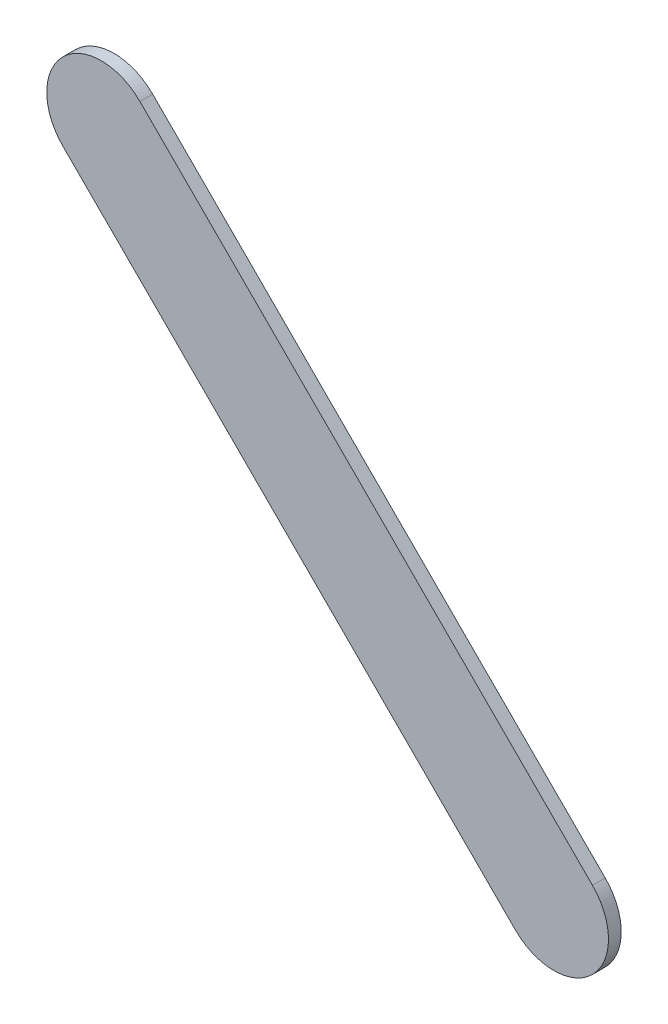
ISO-10303-21;
HEADER;
FILE_DESCRIPTION(('STEP AP214'),'2;1');
FILE_NAME('part.step','',(''),(''),'','','');
FILE_SCHEMA(('AUTOMOTIVE_DESIGN { 1 0 10303 214 1 1 1 1 }'));
ENDSEC;
DATA;
#1=APPLICATION_CONTEXT('core data for automotive mechanical design processes');
#2=APPLICATION_PROTOCOL_DEFINITION('international standard','automotive_design',2000,#1);
#3=PRODUCT_CONTEXT('',#1,'mechanical');
#4=PRODUCT('Part','Part','',(#3));
#5=PRODUCT_RELATED_PRODUCT_CATEGORY('part','',(#4));
#6=PRODUCT_DEFINITION_FORMATION('','',#4);
#7=PRODUCT_DEFINITION_CONTEXT('part definition',#1,'design');
#8=PRODUCT_DEFINITION('design','',#6,#7);
#9=PRODUCT_DEFINITION_SHAPE('','',#8);
#10=(LENGTH_UNIT() NAMED_UNIT(*) SI_UNIT(.MILLI.,.METRE.));
#11=(NAMED_UNIT(*) PLANE_ANGLE_UNIT() SI_UNIT($,.RADIAN.));
#12=(NAMED_UNIT(*) SI_UNIT($,.STERADIAN.) SOLID_ANGLE_UNIT());
#13=UNCERTAINTY_MEASURE_WITH_UNIT(LENGTH_MEASURE(1.E-05),#10,'distance_accuracy_value','');
#14=(GEOMETRIC_REPRESENTATION_CONTEXT(3) GLOBAL_UNCERTAINTY_ASSIGNED_CONTEXT((#13)) GLOBAL_UNIT_ASSIGNED_CONTEXT((#10,
#11,#12)) REPRESENTATION_CONTEXT('',''));
#15=CARTESIAN_POINT('',(0.,0.,0.));
#16=DIRECTION('',(0.,0.,1.));
#17=DIRECTION('',(1.,0.,0.));
#18=AXIS2_PLACEMENT_3D('',#15,#16,#17);
#19=CARTESIAN_POINT('',(95.259619,-129.493933,1.635));
#20=DIRECTION('',(0.,0.,1.));
#21=DIRECTION('',(1.,0.,0.));
#22=AXIS2_PLACEMENT_3D('',#19,#20,#21);
#23=PLANE('',#22);
#24=DIRECTION('',(-0.707106781186548,0.707106781186548,0.));
#25=VECTOR('',#24,1.);
#26=CARTESIAN_POINT('',(95.259619,-129.493933,1.635));
#27=LINE('',#26,#25);
#28=CARTESIAN_POINT('',(95.259619,-129.493933,1.635));
#29=VERTEX_POINT('',#28);
#30=CARTESIAN_POINT('',(94.015254,-128.249568,1.635));
#31=VERTEX_POINT('',#30);
#32=EDGE_CURVE('E82',#29,#31,#27,.T.);
#33=ORIENTED_EDGE('',*,*,#32,.T.);
#34=CARTESIAN_POINT('',(93.9091875,-128.3556345,1.635));
#35=DIRECTION('',(0.,0.,1.));
#36=DIRECTION('',(0.707106781186548,0.707106781186548,0.));
#37=AXIS2_PLACEMENT_3D('',#34,#35,#36);
#38=CIRCLE('',#37,0.150000682813);
#39=CARTESIAN_POINT('',(93.803121,-128.461701,1.635));
#40=VERTEX_POINT('',#39);
#41=EDGE_CURVE('E110',#31,#40,#38,.T.);
#42=ORIENTED_EDGE('',*,*,#41,.T.);
#43=DIRECTION('',(0.707106781186548,-0.707106781186548,0.));
#44=VECTOR('',#43,1.);
#45=CARTESIAN_POINT('',(93.803121,-128.461701,1.635));
#46=LINE('',#45,#44);
#47=CARTESIAN_POINT('',(95.047486,-129.706066,1.635));
#48=VERTEX_POINT('',#47);
#49=EDGE_CURVE('E75',#40,#48,#46,.T.);
#50=ORIENTED_EDGE('',*,*,#49,.T.);
#51=CARTESIAN_POINT('',(95.1535525,-129.5999995,1.635));
#52=DIRECTION('',(0.,0.,1.));
#53=DIRECTION('',(-0.707106781186548,-0.707106781186548,0.));
#54=AXIS2_PLACEMENT_3D('',#51,#52,#53);
#55=CIRCLE('',#54,0.150000682813);
#56=EDGE_CURVE('E11',#48,#29,#55,.T.);
#57=ORIENTED_EDGE('',*,*,#56,.T.);
#58=EDGE_LOOP('',(#33,#42,#50,#57));
#59=FACE_BOUND('',#58,.T.);
#60=ADVANCED_FACE('F17',(#59),#23,.T.);
#61=CARTESIAN_POINT('',(95.259619,-129.493933,1.6));
#62=DIRECTION('',(0.,0.,1.));
#63=DIRECTION('',(1.,0.,0.));
#64=AXIS2_PLACEMENT_3D('',#61,#62,#63);
#65=PLANE('',#64);
#66=CARTESIAN_POINT('',(95.1535525,-129.5999995,1.6));
#67=DIRECTION('',(0.,0.,1.));
#68=DIRECTION('',(-0.707106781186548,-0.707106781186548,0.));
#69=AXIS2_PLACEMENT_3D('',#66,#67,#68);
#70=CIRCLE('',#69,0.150000682813);
#71=CARTESIAN_POINT('',(95.047486,-129.706066,1.6));
#72=VERTEX_POINT('',#71);
#73=CARTESIAN_POINT('',(95.259619,-129.493933,1.6));
#74=VERTEX_POINT('',#73);
#75=EDGE_CURVE('E20',#72,#74,#70,.T.);
#76=ORIENTED_EDGE('',*,*,#75,.F.);
#77=DIRECTION('',(0.707106781186548,-0.707106781186548,0.));
#78=VECTOR('',#77,1.);
#79=CARTESIAN_POINT('',(93.803121,-128.461701,1.6));
#80=LINE('',#79,#78);
#81=CARTESIAN_POINT('',(93.803121,-128.461701,1.6));
#82=VERTEX_POINT('',#81);
#83=EDGE_CURVE('E101',#82,#72,#80,.T.);
#84=ORIENTED_EDGE('',*,*,#83,.F.);
#85=CARTESIAN_POINT('',(93.9091875,-128.3556345,1.6));
#86=DIRECTION('',(0.,0.,1.));
#87=DIRECTION('',(0.707106781186548,0.707106781186548,0.));
#88=AXIS2_PLACEMENT_3D('',#85,#86,#87);
#89=CIRCLE('',#88,0.150000682813);
#90=CARTESIAN_POINT('',(94.015254,-128.249568,1.6));
#91=VERTEX_POINT('',#90);
#92=EDGE_CURVE('E84',#91,#82,#89,.T.);
#93=ORIENTED_EDGE('',*,*,#92,.F.);
#94=DIRECTION('',(-0.707106781186548,0.707106781186548,0.));
#95=VECTOR('',#94,1.);
#96=CARTESIAN_POINT('',(95.259619,-129.493933,1.6));
#97=LINE('',#96,#95);
#98=EDGE_CURVE('E80',#74,#91,#97,.T.);
#99=ORIENTED_EDGE('',*,*,#98,.F.);
#100=EDGE_LOOP('',(#76,#84,#93,#99));
#101=FACE_BOUND('',#100,.T.);
#102=ADVANCED_FACE('F86',(#101),#65,.F.);
#103=CARTESIAN_POINT('',(95.1535525,-129.5999995,1.6));
#104=DIRECTION('',(0.,0.,-1.));
#105=DIRECTION('',(-0.707106781186548,-0.707106781186548,0.));
#106=AXIS2_PLACEMENT_3D('',#103,#104,#105);
#107=CYLINDRICAL_SURFACE('',#106,0.150000682813);
#108=ORIENTED_EDGE('',*,*,#75,.T.);
#109=DIRECTION('',(0.,0.,1.));
#110=VECTOR('',#109,1.);
#111=CARTESIAN_POINT('',(95.259619,-129.493933,1.6));
#112=LINE('',#111,#110);
#113=EDGE_CURVE('E69',#74,#29,#112,.T.);
#114=ORIENTED_EDGE('',*,*,#113,.T.);
#115=ORIENTED_EDGE('',*,*,#56,.F.);
#116=DIRECTION('',(0.,0.,1.));
#117=VECTOR('',#116,1.);
#118=CARTESIAN_POINT('',(95.047486,-129.706066,1.6));
#119=LINE('',#118,#117);
#120=EDGE_CURVE('E72',#72,#48,#119,.T.);
#121=ORIENTED_EDGE('',*,*,#120,.F.);
#122=EDGE_LOOP('',(#108,#114,#115,#121));
#123=FACE_BOUND('',#122,.T.);
#124=ADVANCED_FACE('F68',(#123),#107,.T.);
#125=CARTESIAN_POINT('',(93.803121,-128.461701,1.6));
#126=DIRECTION('',(0.707106781186548,0.707106781186548,0.));
#127=DIRECTION('',(0.,0.,-1.));
#128=AXIS2_PLACEMENT_3D('',#125,#126,#127);
#129=PLANE('',#128);
#130=ORIENTED_EDGE('',*,*,#83,.T.);
#131=ORIENTED_EDGE('',*,*,#120,.T.);
#132=ORIENTED_EDGE('',*,*,#49,.F.);
#133=DIRECTION('',(0.,0.,1.));
#134=VECTOR('',#133,1.);
#135=CARTESIAN_POINT('',(93.803121,-128.461701,1.6));
#136=LINE('',#135,#134);
#137=EDGE_CURVE('E106',#82,#40,#136,.T.);
#138=ORIENTED_EDGE('',*,*,#137,.F.);
#139=EDGE_LOOP('',(#130,#131,#132,#138));
#140=FACE_BOUND('',#139,.T.);
#141=ADVANCED_FACE('F118',(#140),#129,.F.);
#142=CARTESIAN_POINT('',(93.9091875,-128.3556345,1.6));
#143=DIRECTION('',(0.,0.,-1.));
#144=DIRECTION('',(0.707106781186548,0.707106781186548,0.));
#145=AXIS2_PLACEMENT_3D('',#142,#143,#144);
#146=CYLINDRICAL_SURFACE('',#145,0.150000682813);
#147=ORIENTED_EDGE('',*,*,#92,.T.);
#148=ORIENTED_EDGE('',*,*,#137,.T.);
#149=ORIENTED_EDGE('',*,*,#41,.F.);
#150=DIRECTION('',(0.,0.,1.));
#151=VECTOR('',#150,1.);
#152=CARTESIAN_POINT('',(94.015254,-128.249568,1.6));
#153=LINE('',#152,#151);
#154=EDGE_CURVE('E90',#91,#31,#153,.T.);
#155=ORIENTED_EDGE('',*,*,#154,.F.);
#156=EDGE_LOOP('',(#147,#148,#149,#155));
#157=FACE_BOUND('',#156,.T.);
#158=ADVANCED_FACE('F120',(#157),#146,.T.);
#159=CARTESIAN_POINT('',(95.259619,-129.493933,1.6));
#160=DIRECTION('',(-0.707106781186548,-0.707106781186548,0.));
#161=DIRECTION('',(-0.707106781186548,0.707106781186548,0.));
#162=AXIS2_PLACEMENT_3D('',#159,#160,#161);
#163=PLANE('',#162);
#164=ORIENTED_EDGE('',*,*,#98,.T.);
#165=ORIENTED_EDGE('',*,*,#154,.T.);
#166=ORIENTED_EDGE('',*,*,#32,.F.);
#167=ORIENTED_EDGE('',*,*,#113,.F.);
#168=EDGE_LOOP('',(#164,#165,#166,#167));
#169=FACE_BOUND('',#168,.T.);
#170=ADVANCED_FACE('F78',(#169),#163,.F.);
#171=CLOSED_SHELL('',(#60,#102,#124,#141,#158,#170));
#172=MANIFOLD_SOLID_BREP('B1',#171);
#173=ADVANCED_BREP_SHAPE_REPRESENTATION('',(#18,#172),#14);
#174=SHAPE_DEFINITION_REPRESENTATION(#9,#173);
ENDSEC;
END-ISO-10303-21;
